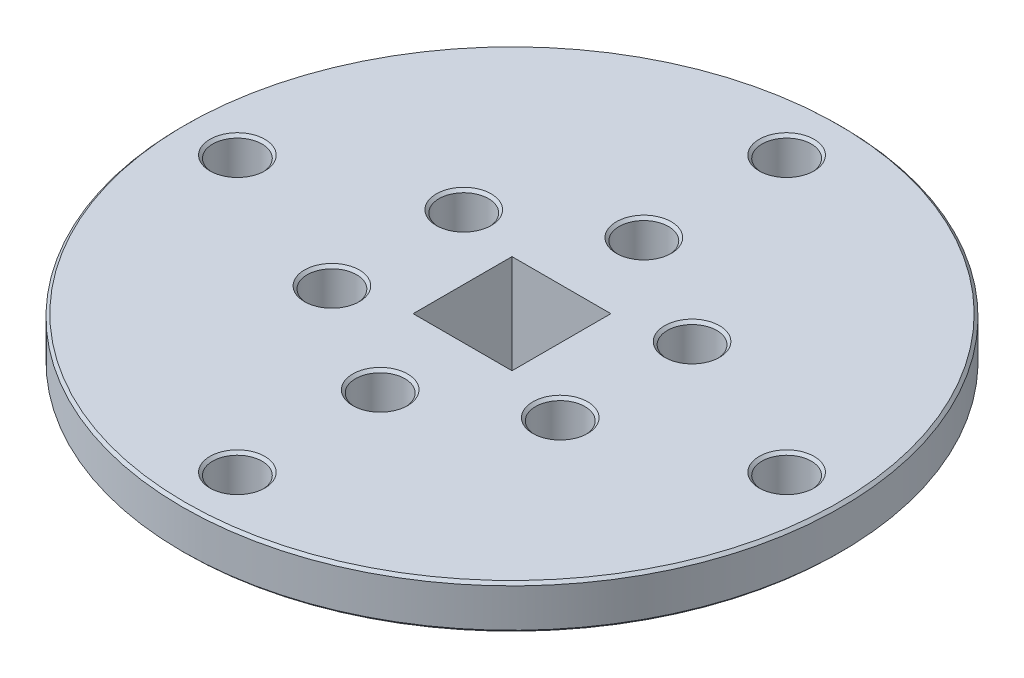
ISO-10303-21;
HEADER;
FILE_DESCRIPTION(('STEP AP214'),'2;1');
FILE_NAME('part.step','',(''),(''),'','','');
FILE_SCHEMA(('AUTOMOTIVE_DESIGN { 1 0 10303 214 1 1 1 1 }'));
ENDSEC;
DATA;
#1=APPLICATION_CONTEXT('core data for automotive mechanical design processes');
#2=APPLICATION_PROTOCOL_DEFINITION('international standard','automotive_design',2000,#1);
#3=PRODUCT_CONTEXT('',#1,'mechanical');
#4=PRODUCT('Part','Part','',(#3));
#5=PRODUCT_RELATED_PRODUCT_CATEGORY('part','',(#4));
#6=PRODUCT_DEFINITION_FORMATION('','',#4);
#7=PRODUCT_DEFINITION_CONTEXT('part definition',#1,'design');
#8=PRODUCT_DEFINITION('design','',#6,#7);
#9=PRODUCT_DEFINITION_SHAPE('','',#8);
#10=(LENGTH_UNIT() NAMED_UNIT(*) SI_UNIT(.MILLI.,.METRE.));
#11=(NAMED_UNIT(*) PLANE_ANGLE_UNIT() SI_UNIT($,.RADIAN.));
#12=(NAMED_UNIT(*) SI_UNIT($,.STERADIAN.) SOLID_ANGLE_UNIT());
#13=UNCERTAINTY_MEASURE_WITH_UNIT(LENGTH_MEASURE(1.E-05),#10,'distance_accuracy_value','');
#14=(GEOMETRIC_REPRESENTATION_CONTEXT(3) GLOBAL_UNCERTAINTY_ASSIGNED_CONTEXT((#13)) GLOBAL_UNIT_ASSIGNED_CONTEXT((#10,
#11,#12)) REPRESENTATION_CONTEXT('',''));
#15=CARTESIAN_POINT('',(0.,0.,0.));
#16=DIRECTION('',(0.,0.,1.));
#17=DIRECTION('',(1.,0.,0.));
#18=AXIS2_PLACEMENT_3D('',#15,#16,#17);
#19=CARTESIAN_POINT('',(0.,5.,0.));
#20=DIRECTION('',(0.,-1.,0.));
#21=DIRECTION('',(0.,0.,-1.));
#22=AXIS2_PLACEMENT_3D('',#19,#20,#21);
#23=CYLINDRICAL_SURFACE('',#22,20.5);
#24=CARTESIAN_POINT('',(0.,0.24999999999999,0.));
#25=DIRECTION('',(0.,1.,0.));
#26=DIRECTION('',(0.,0.,1.));
#27=AXIS2_PLACEMENT_3D('',#24,#25,#26);
#28=CIRCLE('',#27,20.5);
#29=CARTESIAN_POINT('',(0.,0.24999999999999,20.5));
#30=VERTEX_POINT('',#29);
#31=EDGE_CURVE('E11',#30,#30,#28,.T.);
#32=ORIENTED_EDGE('',*,*,#31,.T.);
#33=EDGE_LOOP('',(#32));
#34=FACE_BOUND('',#33,.T.);
#35=CARTESIAN_POINT('',(0.,5.,0.));
#36=DIRECTION('',(0.,1.,0.));
#37=DIRECTION('',(0.,0.,1.));
#38=AXIS2_PLACEMENT_3D('',#35,#36,#37);
#39=CIRCLE('',#38,20.5);
#40=CARTESIAN_POINT('',(0.,5.,20.5));
#41=VERTEX_POINT('',#40);
#42=EDGE_CURVE('E89',#41,#41,#39,.T.);
#43=ORIENTED_EDGE('',*,*,#42,.F.);
#44=EDGE_LOOP('',(#43));
#45=FACE_BOUND('',#44,.T.);
#46=ADVANCED_FACE('F41',(#34,#45),#23,.T.);
#47=CARTESIAN_POINT('',(0.,0.,0.));
#48=DIRECTION('',(0.,1.,0.));
#49=DIRECTION('',(0.,0.,1.));
#50=AXIS2_PLACEMENT_3D('',#47,#48,#49);
#51=PLANE('',#50);
#52=CARTESIAN_POINT('',(0.,0.,-12.));
#53=DIRECTION('',(0.,1.,0.));
#54=DIRECTION('',(0.,0.,1.));
#55=AXIS2_PLACEMENT_3D('',#52,#53,#54);
#56=CIRCLE('',#55,2.49999999999999);
#57=CARTESIAN_POINT('',(0.,0.,-9.50000000000001));
#58=VERTEX_POINT('',#57);
#59=EDGE_CURVE('E176',#58,#58,#56,.T.);
#60=ORIENTED_EDGE('',*,*,#59,.T.);
#61=EDGE_LOOP('',(#60));
#62=FACE_BOUND('',#61,.T.);
#63=CARTESIAN_POINT('',(10.3923048454133,0.,-5.99999999999998));
#64=DIRECTION('',(0.,1.,0.));
#65=DIRECTION('',(0.,0.,1.));
#66=AXIS2_PLACEMENT_3D('',#63,#64,#65);
#67=CIRCLE('',#66,2.49999999999999);
#68=CARTESIAN_POINT('',(10.3923048454133,0.,-3.49999999999999));
#69=VERTEX_POINT('',#68);
#70=EDGE_CURVE('E173',#69,#69,#67,.T.);
#71=ORIENTED_EDGE('',*,*,#70,.T.);
#72=EDGE_LOOP('',(#71));
#73=FACE_BOUND('',#72,.T.);
#74=CARTESIAN_POINT('',(10.3923048454132,0.,6.00000000000005));
#75=DIRECTION('',(0.,1.,0.));
#76=DIRECTION('',(0.,0.,1.));
#77=AXIS2_PLACEMENT_3D('',#74,#75,#76);
#78=CIRCLE('',#77,2.5);
#79=CARTESIAN_POINT('',(10.3923048454132,0.,8.50000000000005));
#80=VERTEX_POINT('',#79);
#81=EDGE_CURVE('E170',#80,#80,#78,.T.);
#82=ORIENTED_EDGE('',*,*,#81,.T.);
#83=EDGE_LOOP('',(#82));
#84=FACE_BOUND('',#83,.T.);
#85=CARTESIAN_POINT('',(0.,0.,12.));
#86=DIRECTION('',(0.,1.,0.));
#87=DIRECTION('',(0.,0.,1.));
#88=AXIS2_PLACEMENT_3D('',#85,#86,#87);
#89=CIRCLE('',#88,2.50000000000001);
#90=CARTESIAN_POINT('',(0.,0.,14.5));
#91=VERTEX_POINT('',#90);
#92=EDGE_CURVE('E167',#91,#91,#89,.T.);
#93=ORIENTED_EDGE('',*,*,#92,.T.);
#94=EDGE_LOOP('',(#93));
#95=FACE_BOUND('',#94,.T.);
#96=CARTESIAN_POINT('',(-10.3923048454133,0.,5.99999999999991));
#97=DIRECTION('',(0.,1.,0.));
#98=DIRECTION('',(0.,0.,1.));
#99=AXIS2_PLACEMENT_3D('',#96,#97,#98);
#100=CIRCLE('',#99,2.5);
#101=CARTESIAN_POINT('',(-10.3923048454133,0.,8.4999999999999));
#102=VERTEX_POINT('',#101);
#103=EDGE_CURVE('E164',#102,#102,#100,.T.);
#104=ORIENTED_EDGE('',*,*,#103,.T.);
#105=EDGE_LOOP('',(#104));
#106=FACE_BOUND('',#105,.T.);
#107=CARTESIAN_POINT('',(-10.3923048454132,0.,-6.00000000000012));
#108=DIRECTION('',(0.,1.,0.));
#109=DIRECTION('',(0.,0.,1.));
#110=AXIS2_PLACEMENT_3D('',#107,#108,#109);
#111=CIRCLE('',#110,2.50000000000001);
#112=CARTESIAN_POINT('',(-10.3923048454132,0.,-3.50000000000011));
#113=VERTEX_POINT('',#112);
#114=EDGE_CURVE('E161',#113,#113,#111,.T.);
#115=ORIENTED_EDGE('',*,*,#114,.T.);
#116=EDGE_LOOP('',(#115));
#117=FACE_BOUND('',#116,.T.);
#118=CARTESIAN_POINT('',(0.,0.,0.));
#119=DIRECTION('',(0.,1.,0.));
#120=DIRECTION('',(0.,0.,1.));
#121=AXIS2_PLACEMENT_3D('',#118,#119,#120);
#122=CIRCLE('',#121,20.25);
#123=CARTESIAN_POINT('',(0.,0.,20.25));
#124=VERTEX_POINT('',#123);
#125=EDGE_CURVE('E158',#124,#124,#122,.F.);
#126=ORIENTED_EDGE('',*,*,#125,.T.);
#127=EDGE_LOOP('',(#126));
#128=FACE_BOUND('',#127,.T.);
#129=DIRECTION('',(-1.,0.,0.));
#130=VECTOR('',#129,1.);
#131=CARTESIAN_POINT('',(-4.5,0.,4.5));
#132=LINE('',#131,#130);
#133=CARTESIAN_POINT('',(4.5,0.,4.5));
#134=VERTEX_POINT('',#133);
#135=CARTESIAN_POINT('',(-4.5,0.,4.5));
#136=VERTEX_POINT('',#135);
#137=EDGE_CURVE('E101',#134,#136,#132,.T.);
#138=ORIENTED_EDGE('',*,*,#137,.F.);
#139=DIRECTION('',(0.,0.,1.));
#140=VECTOR('',#139,1.);
#141=CARTESIAN_POINT('',(4.5,0.,-4.5));
#142=LINE('',#141,#140);
#143=CARTESIAN_POINT('',(4.5,0.,-4.5));
#144=VERTEX_POINT('',#143);
#145=EDGE_CURVE('E57',#144,#134,#142,.T.);
#146=ORIENTED_EDGE('',*,*,#145,.F.);
#147=DIRECTION('',(1.,0.,0.));
#148=VECTOR('',#147,1.);
#149=CARTESIAN_POINT('',(-4.5,0.,-4.5));
#150=LINE('',#149,#148);
#151=CARTESIAN_POINT('',(-4.5,0.,-4.5));
#152=VERTEX_POINT('',#151);
#153=EDGE_CURVE('E95',#152,#144,#150,.T.);
#154=ORIENTED_EDGE('',*,*,#153,.F.);
#155=DIRECTION('',(0.,0.,-1.));
#156=VECTOR('',#155,1.);
#157=CARTESIAN_POINT('',(-4.5,0.,-4.5));
#158=LINE('',#157,#156);
#159=EDGE_CURVE('E108',#136,#152,#158,.T.);
#160=ORIENTED_EDGE('',*,*,#159,.F.);
#161=EDGE_LOOP('',(#138,#146,#154,#160));
#162=FACE_BOUND('',#161,.T.);
#163=ADVANCED_FACE('F275',(#62,#73,#84,#95,#106,#117,#128,#162),#51,.F.);
#164=CARTESIAN_POINT('',(0.,9.,0.));
#165=DIRECTION('',(0.,-1.,0.));
#166=DIRECTION('',(0.,0.,-1.));
#167=AXIS2_PLACEMENT_3D('',#164,#165,#166);
#168=CYLINDRICAL_SURFACE('',#167,30.);
#169=CARTESIAN_POINT('',(0.,8.75,0.));
#170=DIRECTION('',(0.,1.,0.));
#171=DIRECTION('',(0.,0.,1.));
#172=AXIS2_PLACEMENT_3D('',#169,#170,#171);
#173=CIRCLE('',#172,30.);
#174=CARTESIAN_POINT('',(0.,8.75,30.));
#175=VERTEX_POINT('',#174);
#176=EDGE_CURVE('E50',#175,#175,#173,.F.);
#177=ORIENTED_EDGE('',*,*,#176,.T.);
#178=EDGE_LOOP('',(#177));
#179=FACE_BOUND('',#178,.T.);
#180=CARTESIAN_POINT('',(0.,5.25,0.));
#181=DIRECTION('',(0.,1.,0.));
#182=DIRECTION('',(0.,0.,1.));
#183=AXIS2_PLACEMENT_3D('',#180,#181,#182);
#184=CIRCLE('',#183,30.);
#185=CARTESIAN_POINT('',(0.,5.25,30.));
#186=VERTEX_POINT('',#185);
#187=EDGE_CURVE('E248',#186,#186,#184,.T.);
#188=ORIENTED_EDGE('',*,*,#187,.T.);
#189=EDGE_LOOP('',(#188));
#190=FACE_BOUND('',#189,.T.);
#191=ADVANCED_FACE('F253',(#179,#190),#168,.T.);
#192=CARTESIAN_POINT('',(0.,9.,0.));
#193=DIRECTION('',(0.,1.,0.));
#194=DIRECTION('',(0.,0.,1.));
#195=AXIS2_PLACEMENT_3D('',#192,#193,#194);
#196=PLANE('',#195);
#197=CARTESIAN_POINT('',(0.,9.,-12.));
#198=DIRECTION('',(0.,1.,0.));
#199=DIRECTION('',(0.,0.,1.));
#200=AXIS2_PLACEMENT_3D('',#197,#198,#199);
#201=CIRCLE('',#200,2.50000000000001);
#202=CARTESIAN_POINT('',(0.,9.,-9.49999999999999));
#203=VERTEX_POINT('',#202);
#204=EDGE_CURVE('E155',#203,#203,#201,.F.);
#205=ORIENTED_EDGE('',*,*,#204,.T.);
#206=EDGE_LOOP('',(#205));
#207=FACE_BOUND('',#206,.T.);
#208=CARTESIAN_POINT('',(10.3923048454133,9.,-5.99999999999998));
#209=DIRECTION('',(0.,1.,0.));
#210=DIRECTION('',(0.,0.,1.));
#211=AXIS2_PLACEMENT_3D('',#208,#209,#210);
#212=CIRCLE('',#211,2.50000000000001);
#213=CARTESIAN_POINT('',(10.3923048454133,9.,-3.49999999999997));
#214=VERTEX_POINT('',#213);
#215=EDGE_CURVE('E152',#214,#214,#212,.F.);
#216=ORIENTED_EDGE('',*,*,#215,.T.);
#217=EDGE_LOOP('',(#216));
#218=FACE_BOUND('',#217,.T.);
#219=CARTESIAN_POINT('',(10.3923048454132,9.,6.00000000000005));
#220=DIRECTION('',(0.,1.,0.));
#221=DIRECTION('',(0.,0.,1.));
#222=AXIS2_PLACEMENT_3D('',#219,#220,#221);
#223=CIRCLE('',#222,2.50000000000001);
#224=CARTESIAN_POINT('',(10.3923048454132,9.,8.50000000000006));
#225=VERTEX_POINT('',#224);
#226=EDGE_CURVE('E149',#225,#225,#223,.F.);
#227=ORIENTED_EDGE('',*,*,#226,.T.);
#228=EDGE_LOOP('',(#227));
#229=FACE_BOUND('',#228,.T.);
#230=CARTESIAN_POINT('',(0.,9.,12.));
#231=DIRECTION('',(0.,1.,0.));
#232=DIRECTION('',(0.,0.,1.));
#233=AXIS2_PLACEMENT_3D('',#230,#231,#232);
#234=CIRCLE('',#233,2.50000000000001);
#235=CARTESIAN_POINT('',(0.,9.,14.5));
#236=VERTEX_POINT('',#235);
#237=EDGE_CURVE('E146',#236,#236,#234,.F.);
#238=ORIENTED_EDGE('',*,*,#237,.T.);
#239=EDGE_LOOP('',(#238));
#240=FACE_BOUND('',#239,.T.);
#241=CARTESIAN_POINT('',(-10.3923048454133,9.,5.99999999999991));
#242=DIRECTION('',(0.,1.,0.));
#243=DIRECTION('',(0.,0.,1.));
#244=AXIS2_PLACEMENT_3D('',#241,#242,#243);
#245=CIRCLE('',#244,2.50000000000001);
#246=CARTESIAN_POINT('',(-10.3923048454133,9.,8.49999999999991));
#247=VERTEX_POINT('',#246);
#248=EDGE_CURVE('E143',#247,#247,#245,.F.);
#249=ORIENTED_EDGE('',*,*,#248,.T.);
#250=EDGE_LOOP('',(#249));
#251=FACE_BOUND('',#250,.T.);
#252=CARTESIAN_POINT('',(-10.3923048454132,9.,-6.00000000000012));
#253=DIRECTION('',(0.,1.,0.));
#254=DIRECTION('',(0.,0.,1.));
#255=AXIS2_PLACEMENT_3D('',#252,#253,#254);
#256=CIRCLE('',#255,2.50000000000001);
#257=CARTESIAN_POINT('',(-10.3923048454132,9.,-3.50000000000011));
#258=VERTEX_POINT('',#257);
#259=EDGE_CURVE('E140',#258,#258,#256,.F.);
#260=ORIENTED_EDGE('',*,*,#259,.T.);
#261=EDGE_LOOP('',(#260));
#262=FACE_BOUND('',#261,.T.);
#263=CARTESIAN_POINT('',(0.,9.,-25.));
#264=DIRECTION('',(0.,1.,0.));
#265=DIRECTION('',(0.,0.,1.));
#266=AXIS2_PLACEMENT_3D('',#263,#264,#265);
#267=CIRCLE('',#266,2.5);
#268=CARTESIAN_POINT('',(0.,9.,-22.5));
#269=VERTEX_POINT('',#268);
#270=EDGE_CURVE('E137',#269,#269,#267,.F.);
#271=ORIENTED_EDGE('',*,*,#270,.T.);
#272=EDGE_LOOP('',(#271));
#273=FACE_BOUND('',#272,.T.);
#274=CARTESIAN_POINT('',(25.,9.,0.));
#275=DIRECTION('',(0.,1.,0.));
#276=DIRECTION('',(0.,0.,1.));
#277=AXIS2_PLACEMENT_3D('',#274,#275,#276);
#278=CIRCLE('',#277,2.49999999999999);
#279=CARTESIAN_POINT('',(25.,9.,2.49999999999999));
#280=VERTEX_POINT('',#279);
#281=EDGE_CURVE('E134',#280,#280,#278,.F.);
#282=ORIENTED_EDGE('',*,*,#281,.T.);
#283=EDGE_LOOP('',(#282));
#284=FACE_BOUND('',#283,.T.);
#285=CARTESIAN_POINT('',(0.,9.,25.));
#286=DIRECTION('',(0.,1.,0.));
#287=DIRECTION('',(0.,0.,1.));
#288=AXIS2_PLACEMENT_3D('',#285,#286,#287);
#289=CIRCLE('',#288,2.5);
#290=CARTESIAN_POINT('',(0.,9.,27.5));
#291=VERTEX_POINT('',#290);
#292=EDGE_CURVE('E131',#291,#291,#289,.F.);
#293=ORIENTED_EDGE('',*,*,#292,.T.);
#294=EDGE_LOOP('',(#293));
#295=FACE_BOUND('',#294,.T.);
#296=CARTESIAN_POINT('',(-25.,9.,0.));
#297=DIRECTION('',(0.,1.,0.));
#298=DIRECTION('',(0.,0.,1.));
#299=AXIS2_PLACEMENT_3D('',#296,#297,#298);
#300=CIRCLE('',#299,2.49999999999999);
#301=CARTESIAN_POINT('',(-25.,9.,2.49999999999999));
#302=VERTEX_POINT('',#301);
#303=EDGE_CURVE('E128',#302,#302,#300,.F.);
#304=ORIENTED_EDGE('',*,*,#303,.T.);
#305=EDGE_LOOP('',(#304));
#306=FACE_BOUND('',#305,.T.);
#307=CARTESIAN_POINT('',(0.,9.,0.));
#308=DIRECTION('',(0.,1.,0.));
#309=DIRECTION('',(0.,0.,1.));
#310=AXIS2_PLACEMENT_3D('',#307,#308,#309);
#311=CIRCLE('',#310,29.75);
#312=CARTESIAN_POINT('',(0.,9.,29.75));
#313=VERTEX_POINT('',#312);
#314=EDGE_CURVE('E125',#313,#313,#311,.T.);
#315=ORIENTED_EDGE('',*,*,#314,.T.);
#316=EDGE_LOOP('',(#315));
#317=FACE_BOUND('',#316,.T.);
#318=DIRECTION('',(0.,0.,1.));
#319=VECTOR('',#318,1.);
#320=CARTESIAN_POINT('',(4.5,9.,-4.5));
#321=LINE('',#320,#319);
#322=CARTESIAN_POINT('',(4.5,9.,-4.5));
#323=VERTEX_POINT('',#322);
#324=CARTESIAN_POINT('',(4.5,9.,4.5));
#325=VERTEX_POINT('',#324);
#326=EDGE_CURVE('E93',#323,#325,#321,.T.);
#327=ORIENTED_EDGE('',*,*,#326,.T.);
#328=DIRECTION('',(-1.,0.,0.));
#329=VECTOR('',#328,1.);
#330=CARTESIAN_POINT('',(-4.5,9.,4.5));
#331=LINE('',#330,#329);
#332=CARTESIAN_POINT('',(-4.5,9.,4.5));
#333=VERTEX_POINT('',#332);
#334=EDGE_CURVE('E82',#325,#333,#331,.T.);
#335=ORIENTED_EDGE('',*,*,#334,.T.);
#336=DIRECTION('',(0.,0.,-1.));
#337=VECTOR('',#336,1.);
#338=CARTESIAN_POINT('',(-4.5,9.,-4.5));
#339=LINE('',#338,#337);
#340=CARTESIAN_POINT('',(-4.5,9.,-4.5));
#341=VERTEX_POINT('',#340);
#342=EDGE_CURVE('E103',#333,#341,#339,.T.);
#343=ORIENTED_EDGE('',*,*,#342,.T.);
#344=DIRECTION('',(1.,0.,0.));
#345=VECTOR('',#344,1.);
#346=CARTESIAN_POINT('',(-4.5,9.,-4.5));
#347=LINE('',#346,#345);
#348=EDGE_CURVE('E99',#341,#323,#347,.T.);
#349=ORIENTED_EDGE('',*,*,#348,.T.);
#350=EDGE_LOOP('',(#327,#335,#343,#349));
#351=FACE_BOUND('',#350,.T.);
#352=ADVANCED_FACE('F98',(#207,#218,#229,#240,#251,#262,#273,#284,#295,#306,#317,#351),#196,.T.);
#353=CARTESIAN_POINT('',(0.,5.,0.));
#354=DIRECTION('',(0.,1.,0.));
#355=DIRECTION('',(0.,0.,1.));
#356=AXIS2_PLACEMENT_3D('',#353,#354,#355);
#357=PLANE('',#356);
#358=CARTESIAN_POINT('',(0.,5.,-25.));
#359=DIRECTION('',(0.,1.,0.));
#360=DIRECTION('',(0.,0.,1.));
#361=AXIS2_PLACEMENT_3D('',#358,#359,#360);
#362=CIRCLE('',#361,2.50000000000001);
#363=CARTESIAN_POINT('',(0.,5.,-22.5));
#364=VERTEX_POINT('',#363);
#365=EDGE_CURVE('E227',#364,#364,#362,.T.);
#366=ORIENTED_EDGE('',*,*,#365,.T.);
#367=EDGE_LOOP('',(#366));
#368=FACE_BOUND('',#367,.T.);
#369=CARTESIAN_POINT('',(25.,5.,0.));
#370=DIRECTION('',(0.,1.,0.));
#371=DIRECTION('',(0.,0.,1.));
#372=AXIS2_PLACEMENT_3D('',#369,#370,#371);
#373=CIRCLE('',#372,2.50000000000001);
#374=CARTESIAN_POINT('',(25.,5.,2.50000000000001));
#375=VERTEX_POINT('',#374);
#376=EDGE_CURVE('E224',#375,#375,#373,.T.);
#377=ORIENTED_EDGE('',*,*,#376,.T.);
#378=EDGE_LOOP('',(#377));
#379=FACE_BOUND('',#378,.T.);
#380=CARTESIAN_POINT('',(0.,5.,25.));
#381=DIRECTION('',(0.,1.,0.));
#382=DIRECTION('',(0.,0.,1.));
#383=AXIS2_PLACEMENT_3D('',#380,#381,#382);
#384=CIRCLE('',#383,2.50000000000001);
#385=CARTESIAN_POINT('',(0.,5.,27.5));
#386=VERTEX_POINT('',#385);
#387=EDGE_CURVE('E221',#386,#386,#384,.T.);
#388=ORIENTED_EDGE('',*,*,#387,.T.);
#389=EDGE_LOOP('',(#388));
#390=FACE_BOUND('',#389,.T.);
#391=CARTESIAN_POINT('',(-25.,5.,0.));
#392=DIRECTION('',(0.,1.,0.));
#393=DIRECTION('',(0.,0.,1.));
#394=AXIS2_PLACEMENT_3D('',#391,#392,#393);
#395=CIRCLE('',#394,2.50000000000001);
#396=CARTESIAN_POINT('',(-25.,5.,2.50000000000001));
#397=VERTEX_POINT('',#396);
#398=EDGE_CURVE('E218',#397,#397,#395,.T.);
#399=ORIENTED_EDGE('',*,*,#398,.T.);
#400=EDGE_LOOP('',(#399));
#401=FACE_BOUND('',#400,.T.);
#402=CARTESIAN_POINT('',(0.,5.,0.));
#403=DIRECTION('',(0.,1.,0.));
#404=DIRECTION('',(0.,0.,1.));
#405=AXIS2_PLACEMENT_3D('',#402,#403,#404);
#406=CIRCLE('',#405,29.75);
#407=CARTESIAN_POINT('',(0.,5.,29.75));
#408=VERTEX_POINT('',#407);
#409=EDGE_CURVE('E215',#408,#408,#406,.F.);
#410=ORIENTED_EDGE('',*,*,#409,.T.);
#411=EDGE_LOOP('',(#410));
#412=FACE_BOUND('',#411,.T.);
#413=ORIENTED_EDGE('',*,*,#42,.T.);
#414=EDGE_LOOP('',(#413));
#415=FACE_BOUND('',#414,.T.);
#416=ADVANCED_FACE('F265',(#368,#379,#390,#401,#412,#415),#357,.F.);
#417=CARTESIAN_POINT('',(-25.,5.,0.));
#418=DIRECTION('',(0.,-1.,0.));
#419=DIRECTION('',(0.,0.,-1.));
#420=AXIS2_PLACEMENT_3D('',#417,#418,#419);
#421=CYLINDRICAL_SURFACE('',#420,2.25);
#422=CARTESIAN_POINT('',(-25.,5.25,0.));
#423=DIRECTION('',(0.,1.,0.));
#424=DIRECTION('',(0.,0.,1.));
#425=AXIS2_PLACEMENT_3D('',#422,#423,#424);
#426=CIRCLE('',#425,2.25);
#427=CARTESIAN_POINT('',(-25.,5.25,2.25));
#428=VERTEX_POINT('',#427);
#429=EDGE_CURVE('E245',#428,#428,#426,.F.);
#430=ORIENTED_EDGE('',*,*,#429,.T.);
#431=EDGE_LOOP('',(#430));
#432=FACE_BOUND('',#431,.T.);
#433=CARTESIAN_POINT('',(-25.,8.75000000000001,0.));
#434=DIRECTION('',(0.,1.,0.));
#435=DIRECTION('',(0.,0.,1.));
#436=AXIS2_PLACEMENT_3D('',#433,#434,#435);
#437=CIRCLE('',#436,2.25);
#438=CARTESIAN_POINT('',(-25.,8.75000000000001,2.25));
#439=VERTEX_POINT('',#438);
#440=EDGE_CURVE('E242',#439,#439,#437,.T.);
#441=ORIENTED_EDGE('',*,*,#440,.T.);
#442=EDGE_LOOP('',(#441));
#443=FACE_BOUND('',#442,.T.);
#444=ADVANCED_FACE('F272',(#432,#443),#421,.F.);
#445=CARTESIAN_POINT('',(0.,5.,25.));
#446=DIRECTION('',(0.,-1.,0.));
#447=DIRECTION('',(0.,0.,-1.));
#448=AXIS2_PLACEMENT_3D('',#445,#446,#447);
#449=CYLINDRICAL_SURFACE('',#448,2.25);
#450=CARTESIAN_POINT('',(0.,5.25,25.));
#451=DIRECTION('',(0.,1.,0.));
#452=DIRECTION('',(0.,0.,1.));
#453=AXIS2_PLACEMENT_3D('',#450,#451,#452);
#454=CIRCLE('',#453,2.25);
#455=CARTESIAN_POINT('',(0.,5.25,27.25));
#456=VERTEX_POINT('',#455);
#457=EDGE_CURVE('E239',#456,#456,#454,.F.);
#458=ORIENTED_EDGE('',*,*,#457,.T.);
#459=EDGE_LOOP('',(#458));
#460=FACE_BOUND('',#459,.T.);
#461=CARTESIAN_POINT('',(0.,8.75,25.));
#462=DIRECTION('',(0.,1.,0.));
#463=DIRECTION('',(0.,0.,1.));
#464=AXIS2_PLACEMENT_3D('',#461,#462,#463);
#465=CIRCLE('',#464,2.25);
#466=CARTESIAN_POINT('',(0.,8.75,27.25));
#467=VERTEX_POINT('',#466);
#468=EDGE_CURVE('E236',#467,#467,#465,.T.);
#469=ORIENTED_EDGE('',*,*,#468,.T.);
#470=EDGE_LOOP('',(#469));
#471=FACE_BOUND('',#470,.T.);
#472=ADVANCED_FACE('F493',(#460,#471),#449,.F.);
#473=CARTESIAN_POINT('',(25.,5.,0.));
#474=DIRECTION('',(0.,-1.,0.));
#475=DIRECTION('',(0.,0.,-1.));
#476=AXIS2_PLACEMENT_3D('',#473,#474,#475);
#477=CYLINDRICAL_SURFACE('',#476,2.25);
#478=CARTESIAN_POINT('',(25.,5.25,0.));
#479=DIRECTION('',(0.,1.,0.));
#480=DIRECTION('',(0.,0.,1.));
#481=AXIS2_PLACEMENT_3D('',#478,#479,#480);
#482=CIRCLE('',#481,2.25);
#483=CARTESIAN_POINT('',(25.,5.25,2.25));
#484=VERTEX_POINT('',#483);
#485=EDGE_CURVE('E233',#484,#484,#482,.F.);
#486=ORIENTED_EDGE('',*,*,#485,.T.);
#487=EDGE_LOOP('',(#486));
#488=FACE_BOUND('',#487,.T.);
#489=CARTESIAN_POINT('',(25.,8.75000000000001,0.));
#490=DIRECTION('',(0.,1.,0.));
#491=DIRECTION('',(0.,0.,1.));
#492=AXIS2_PLACEMENT_3D('',#489,#490,#491);
#493=CIRCLE('',#492,2.25);
#494=CARTESIAN_POINT('',(25.,8.75000000000001,2.25));
#495=VERTEX_POINT('',#494);
#496=EDGE_CURVE('E230',#495,#495,#493,.T.);
#497=ORIENTED_EDGE('',*,*,#496,.T.);
#498=EDGE_LOOP('',(#497));
#499=FACE_BOUND('',#498,.T.);
#500=ADVANCED_FACE('F489',(#488,#499),#477,.F.);
#501=CARTESIAN_POINT('',(0.,5.,-25.));
#502=DIRECTION('',(0.,-1.,0.));
#503=DIRECTION('',(0.,0.,-1.));
#504=AXIS2_PLACEMENT_3D('',#501,#502,#503);
#505=CYLINDRICAL_SURFACE('',#504,2.25);
#506=CARTESIAN_POINT('',(0.,5.25,-25.));
#507=DIRECTION('',(0.,1.,0.));
#508=DIRECTION('',(0.,0.,1.));
#509=AXIS2_PLACEMENT_3D('',#506,#507,#508);
#510=CIRCLE('',#509,2.25);
#511=CARTESIAN_POINT('',(0.,5.25,-22.75));
#512=VERTEX_POINT('',#511);
#513=EDGE_CURVE('E212',#512,#512,#510,.F.);
#514=ORIENTED_EDGE('',*,*,#513,.T.);
#515=EDGE_LOOP('',(#514));
#516=FACE_BOUND('',#515,.T.);
#517=CARTESIAN_POINT('',(0.,8.75,-25.));
#518=DIRECTION('',(0.,1.,0.));
#519=DIRECTION('',(0.,0.,1.));
#520=AXIS2_PLACEMENT_3D('',#517,#518,#519);
#521=CIRCLE('',#520,2.25);
#522=CARTESIAN_POINT('',(0.,8.75,-22.75));
#523=VERTEX_POINT('',#522);
#524=EDGE_CURVE('E209',#523,#523,#521,.T.);
#525=ORIENTED_EDGE('',*,*,#524,.T.);
#526=EDGE_LOOP('',(#525));
#527=FACE_BOUND('',#526,.T.);
#528=ADVANCED_FACE('F485',(#516,#527),#505,.F.);
#529=CARTESIAN_POINT('',(-10.3923048454132,9.,-6.00000000000012));
#530=DIRECTION('',(0.,1.,0.));
#531=DIRECTION('',(0.,0.,1.));
#532=AXIS2_PLACEMENT_3D('',#529,#530,#531);
#533=CYLINDRICAL_SURFACE('',#532,2.25);
#534=CARTESIAN_POINT('',(-10.3923048454132,8.74999999999999,-6.00000000000012));
#535=DIRECTION('',(0.,1.,0.));
#536=DIRECTION('',(0.,0.,1.));
#537=AXIS2_PLACEMENT_3D('',#534,#535,#536);
#538=CIRCLE('',#537,2.25);
#539=CARTESIAN_POINT('',(-10.3923048454132,8.74999999999999,-3.75000000000012));
#540=VERTEX_POINT('',#539);
#541=EDGE_CURVE('E206',#540,#540,#538,.T.);
#542=ORIENTED_EDGE('',*,*,#541,.T.);
#543=EDGE_LOOP('',(#542));
#544=FACE_BOUND('',#543,.T.);
#545=CARTESIAN_POINT('',(-10.3923048454132,0.250000000000007,-6.00000000000012));
#546=DIRECTION('',(0.,1.,0.));
#547=DIRECTION('',(0.,0.,1.));
#548=AXIS2_PLACEMENT_3D('',#545,#546,#547);
#549=CIRCLE('',#548,2.25);
#550=CARTESIAN_POINT('',(-10.3923048454132,0.250000000000007,-3.75000000000012));
#551=VERTEX_POINT('',#550);
#552=EDGE_CURVE('E203',#551,#551,#549,.F.);
#553=ORIENTED_EDGE('',*,*,#552,.T.);
#554=EDGE_LOOP('',(#553));
#555=FACE_BOUND('',#554,.T.);
#556=ADVANCED_FACE('F481',(#544,#555),#533,.F.);
#557=CARTESIAN_POINT('',(-10.3923048454133,9.,5.99999999999991));
#558=DIRECTION('',(0.,1.,0.));
#559=DIRECTION('',(0.,0.,1.));
#560=AXIS2_PLACEMENT_3D('',#557,#558,#559);
#561=CYLINDRICAL_SURFACE('',#560,2.25);
#562=CARTESIAN_POINT('',(-10.3923048454133,8.74999999999999,5.99999999999991));
#563=DIRECTION('',(0.,1.,0.));
#564=DIRECTION('',(0.,0.,1.));
#565=AXIS2_PLACEMENT_3D('',#562,#563,#564);
#566=CIRCLE('',#565,2.25);
#567=CARTESIAN_POINT('',(-10.3923048454133,8.74999999999999,8.24999999999991));
#568=VERTEX_POINT('',#567);
#569=EDGE_CURVE('E200',#568,#568,#566,.T.);
#570=ORIENTED_EDGE('',*,*,#569,.T.);
#571=EDGE_LOOP('',(#570));
#572=FACE_BOUND('',#571,.T.);
#573=CARTESIAN_POINT('',(-10.3923048454133,0.249999999999997,5.99999999999991));
#574=DIRECTION('',(0.,1.,0.));
#575=DIRECTION('',(0.,0.,1.));
#576=AXIS2_PLACEMENT_3D('',#573,#574,#575);
#577=CIRCLE('',#576,2.25);
#578=CARTESIAN_POINT('',(-10.3923048454133,0.249999999999997,8.24999999999991));
#579=VERTEX_POINT('',#578);
#580=EDGE_CURVE('E197',#579,#579,#577,.F.);
#581=ORIENTED_EDGE('',*,*,#580,.T.);
#582=EDGE_LOOP('',(#581));
#583=FACE_BOUND('',#582,.T.);
#584=ADVANCED_FACE('F477',(#572,#583),#561,.F.);
#585=CARTESIAN_POINT('',(0.,9.,12.));
#586=DIRECTION('',(0.,1.,0.));
#587=DIRECTION('',(0.,0.,1.));
#588=AXIS2_PLACEMENT_3D('',#585,#586,#587);
#589=CYLINDRICAL_SURFACE('',#588,2.25);
#590=CARTESIAN_POINT('',(0.,8.74999999999999,12.));
#591=DIRECTION('',(0.,1.,0.));
#592=DIRECTION('',(0.,0.,1.));
#593=AXIS2_PLACEMENT_3D('',#590,#591,#592);
#594=CIRCLE('',#593,2.25);
#595=CARTESIAN_POINT('',(0.,8.74999999999999,14.25));
#596=VERTEX_POINT('',#595);
#597=EDGE_CURVE('E194',#596,#596,#594,.T.);
#598=ORIENTED_EDGE('',*,*,#597,.T.);
#599=EDGE_LOOP('',(#598));
#600=FACE_BOUND('',#599,.T.);
#601=CARTESIAN_POINT('',(0.,0.250000000000007,12.));
#602=DIRECTION('',(0.,1.,0.));
#603=DIRECTION('',(0.,0.,1.));
#604=AXIS2_PLACEMENT_3D('',#601,#602,#603);
#605=CIRCLE('',#604,2.25);
#606=CARTESIAN_POINT('',(0.,0.250000000000007,14.25));
#607=VERTEX_POINT('',#606);
#608=EDGE_CURVE('E191',#607,#607,#605,.F.);
#609=ORIENTED_EDGE('',*,*,#608,.T.);
#610=EDGE_LOOP('',(#609));
#611=FACE_BOUND('',#610,.T.);
#612=ADVANCED_FACE('F473',(#600,#611),#589,.F.);
#613=CARTESIAN_POINT('',(10.3923048454132,9.,6.00000000000005));
#614=DIRECTION('',(0.,1.,0.));
#615=DIRECTION('',(0.,0.,1.));
#616=AXIS2_PLACEMENT_3D('',#613,#614,#615);
#617=CYLINDRICAL_SURFACE('',#616,2.25);
#618=CARTESIAN_POINT('',(10.3923048454132,8.75,6.00000000000005));
#619=DIRECTION('',(0.,1.,0.));
#620=DIRECTION('',(0.,0.,1.));
#621=AXIS2_PLACEMENT_3D('',#618,#619,#620);
#622=CIRCLE('',#621,2.25);
#623=CARTESIAN_POINT('',(10.3923048454132,8.75,8.25000000000005));
#624=VERTEX_POINT('',#623);
#625=EDGE_CURVE('E188',#624,#624,#622,.T.);
#626=ORIENTED_EDGE('',*,*,#625,.T.);
#627=EDGE_LOOP('',(#626));
#628=FACE_BOUND('',#627,.T.);
#629=CARTESIAN_POINT('',(10.3923048454132,0.249999999999995,6.00000000000005));
#630=DIRECTION('',(0.,1.,0.));
#631=DIRECTION('',(0.,0.,1.));
#632=AXIS2_PLACEMENT_3D('',#629,#630,#631);
#633=CIRCLE('',#632,2.25);
#634=CARTESIAN_POINT('',(10.3923048454132,0.249999999999995,8.25000000000005));
#635=VERTEX_POINT('',#634);
#636=EDGE_CURVE('E185',#635,#635,#633,.F.);
#637=ORIENTED_EDGE('',*,*,#636,.T.);
#638=EDGE_LOOP('',(#637));
#639=FACE_BOUND('',#638,.T.);
#640=ADVANCED_FACE('F469',(#628,#639),#617,.F.);
#641=CARTESIAN_POINT('',(10.3923048454133,9.,-5.99999999999998));
#642=DIRECTION('',(0.,1.,0.));
#643=DIRECTION('',(0.,0.,1.));
#644=AXIS2_PLACEMENT_3D('',#641,#642,#643);
#645=CYLINDRICAL_SURFACE('',#644,2.25);
#646=CARTESIAN_POINT('',(10.3923048454133,8.74999999999999,-5.99999999999998));
#647=DIRECTION('',(0.,1.,0.));
#648=DIRECTION('',(0.,0.,1.));
#649=AXIS2_PLACEMENT_3D('',#646,#647,#648);
#650=CIRCLE('',#649,2.25);
#651=CARTESIAN_POINT('',(10.3923048454133,8.74999999999999,-3.74999999999998));
#652=VERTEX_POINT('',#651);
#653=EDGE_CURVE('E182',#652,#652,#650,.T.);
#654=ORIENTED_EDGE('',*,*,#653,.T.);
#655=EDGE_LOOP('',(#654));
#656=FACE_BOUND('',#655,.T.);
#657=CARTESIAN_POINT('',(10.3923048454133,0.249999999999993,-5.99999999999998));
#658=DIRECTION('',(0.,1.,0.));
#659=DIRECTION('',(0.,0.,1.));
#660=AXIS2_PLACEMENT_3D('',#657,#658,#659);
#661=CIRCLE('',#660,2.25);
#662=CARTESIAN_POINT('',(10.3923048454133,0.249999999999993,-3.74999999999998));
#663=VERTEX_POINT('',#662);
#664=EDGE_CURVE('E179',#663,#663,#661,.F.);
#665=ORIENTED_EDGE('',*,*,#664,.T.);
#666=EDGE_LOOP('',(#665));
#667=FACE_BOUND('',#666,.T.);
#668=ADVANCED_FACE('F465',(#656,#667),#645,.F.);
#669=CARTESIAN_POINT('',(0.,9.,-12.));
#670=DIRECTION('',(0.,1.,0.));
#671=DIRECTION('',(0.,0.,1.));
#672=AXIS2_PLACEMENT_3D('',#669,#670,#671);
#673=CYLINDRICAL_SURFACE('',#672,2.25);
#674=CARTESIAN_POINT('',(0.,8.74999999999999,-12.));
#675=DIRECTION('',(0.,1.,0.));
#676=DIRECTION('',(0.,0.,1.));
#677=AXIS2_PLACEMENT_3D('',#674,#675,#676);
#678=CIRCLE('',#677,2.25);
#679=CARTESIAN_POINT('',(0.,8.74999999999999,-9.75));
#680=VERTEX_POINT('',#679);
#681=EDGE_CURVE('E122',#680,#680,#678,.T.);
#682=ORIENTED_EDGE('',*,*,#681,.T.);
#683=EDGE_LOOP('',(#682));
#684=FACE_BOUND('',#683,.T.);
#685=CARTESIAN_POINT('',(0.,0.249999999999993,-12.));
#686=DIRECTION('',(0.,1.,0.));
#687=DIRECTION('',(0.,0.,1.));
#688=AXIS2_PLACEMENT_3D('',#685,#686,#687);
#689=CIRCLE('',#688,2.25);
#690=CARTESIAN_POINT('',(0.,0.249999999999993,-9.75));
#691=VERTEX_POINT('',#690);
#692=EDGE_CURVE('E119',#691,#691,#689,.F.);
#693=ORIENTED_EDGE('',*,*,#692,.T.);
#694=EDGE_LOOP('',(#693));
#695=FACE_BOUND('',#694,.T.);
#696=ADVANCED_FACE('F459',(#684,#695),#673,.F.);
#697=CARTESIAN_POINT('',(4.5,9.001,-4.5));
#698=DIRECTION('',(1.,0.,0.));
#699=DIRECTION('',(0.,0.,-1.));
#700=AXIS2_PLACEMENT_3D('',#697,#698,#699);
#701=PLANE('',#700);
#702=DIRECTION('',(0.,-1.,0.));
#703=VECTOR('',#702,1.);
#704=CARTESIAN_POINT('',(4.5,9.001,-4.5));
#705=LINE('',#704,#703);
#706=EDGE_CURVE('E90',#323,#144,#705,.T.);
#707=ORIENTED_EDGE('',*,*,#706,.T.);
#708=ORIENTED_EDGE('',*,*,#145,.T.);
#709=DIRECTION('',(0.,-1.,0.));
#710=VECTOR('',#709,1.);
#711=CARTESIAN_POINT('',(4.5,9.001,4.5));
#712=LINE('',#711,#710);
#713=EDGE_CURVE('E84',#325,#134,#712,.T.);
#714=ORIENTED_EDGE('',*,*,#713,.F.);
#715=ORIENTED_EDGE('',*,*,#326,.F.);
#716=EDGE_LOOP('',(#707,#708,#714,#715));
#717=FACE_BOUND('',#716,.T.);
#718=ADVANCED_FACE('F92',(#717),#701,.F.);
#719=CARTESIAN_POINT('',(-4.5,9.001,-4.5));
#720=DIRECTION('',(0.,0.,-1.));
#721=DIRECTION('',(-1.,0.,0.));
#722=AXIS2_PLACEMENT_3D('',#719,#720,#721);
#723=PLANE('',#722);
#724=DIRECTION('',(0.,-1.,0.));
#725=VECTOR('',#724,1.);
#726=CARTESIAN_POINT('',(-4.5,9.001,-4.5));
#727=LINE('',#726,#725);
#728=EDGE_CURVE('E114',#341,#152,#727,.T.);
#729=ORIENTED_EDGE('',*,*,#728,.T.);
#730=ORIENTED_EDGE('',*,*,#153,.T.);
#731=ORIENTED_EDGE('',*,*,#706,.F.);
#732=ORIENTED_EDGE('',*,*,#348,.F.);
#733=EDGE_LOOP('',(#729,#730,#731,#732));
#734=FACE_BOUND('',#733,.T.);
#735=ADVANCED_FACE('F451',(#734),#723,.F.);
#736=CARTESIAN_POINT('',(-4.5,9.001,-4.5));
#737=DIRECTION('',(-1.,0.,0.));
#738=DIRECTION('',(0.,0.,1.));
#739=AXIS2_PLACEMENT_3D('',#736,#737,#738);
#740=PLANE('',#739);
#741=DIRECTION('',(0.,-1.,0.));
#742=VECTOR('',#741,1.);
#743=CARTESIAN_POINT('',(-4.5,9.001,4.5));
#744=LINE('',#743,#742);
#745=EDGE_CURVE('E65',#333,#136,#744,.T.);
#746=ORIENTED_EDGE('',*,*,#745,.T.);
#747=ORIENTED_EDGE('',*,*,#159,.T.);
#748=ORIENTED_EDGE('',*,*,#728,.F.);
#749=ORIENTED_EDGE('',*,*,#342,.F.);
#750=EDGE_LOOP('',(#746,#747,#748,#749));
#751=FACE_BOUND('',#750,.T.);
#752=ADVANCED_FACE('F449',(#751),#740,.F.);
#753=CARTESIAN_POINT('',(-4.5,9.001,4.5));
#754=DIRECTION('',(0.,0.,1.));
#755=DIRECTION('',(1.,0.,0.));
#756=AXIS2_PLACEMENT_3D('',#753,#754,#755);
#757=PLANE('',#756);
#758=ORIENTED_EDGE('',*,*,#713,.T.);
#759=ORIENTED_EDGE('',*,*,#137,.T.);
#760=ORIENTED_EDGE('',*,*,#745,.F.);
#761=ORIENTED_EDGE('',*,*,#334,.F.);
#762=EDGE_LOOP('',(#758,#759,#760,#761));
#763=FACE_BOUND('',#762,.T.);
#764=ADVANCED_FACE('F83',(#763),#757,.F.);
#765=CARTESIAN_POINT('',(0.,8.74999999999999,-12.));
#766=DIRECTION('',(0.,1.,0.));
#767=DIRECTION('',(0.,0.,1.));
#768=AXIS2_PLACEMENT_3D('',#765,#766,#767);
#769=CONICAL_SURFACE('',#768,2.25,0.785398163397455);
#770=ORIENTED_EDGE('',*,*,#204,.F.);
#771=EDGE_LOOP('',(#770));
#772=FACE_BOUND('',#771,.T.);
#773=ORIENTED_EDGE('',*,*,#681,.F.);
#774=EDGE_LOOP('',(#773));
#775=FACE_BOUND('',#774,.T.);
#776=ADVANCED_FACE('F291',(#772,#775),#769,.F.);
#777=CARTESIAN_POINT('',(0.,0.,-12.));
#778=DIRECTION('',(0.,-1.,0.));
#779=DIRECTION('',(0.,0.,-1.));
#780=AXIS2_PLACEMENT_3D('',#777,#778,#779);
#781=CONICAL_SURFACE('',#780,2.49999999999999,0.785398163397441);
#782=ORIENTED_EDGE('',*,*,#692,.F.);
#783=EDGE_LOOP('',(#782));
#784=FACE_BOUND('',#783,.T.);
#785=ORIENTED_EDGE('',*,*,#59,.F.);
#786=EDGE_LOOP('',(#785));
#787=FACE_BOUND('',#786,.T.);
#788=ADVANCED_FACE('F297',(#784,#787),#781,.F.);
#789=CARTESIAN_POINT('',(10.3923048454133,8.74999999999999,-5.99999999999998));
#790=DIRECTION('',(0.,1.,0.));
#791=DIRECTION('',(0.,0.,1.));
#792=AXIS2_PLACEMENT_3D('',#789,#790,#791);
#793=CONICAL_SURFACE('',#792,2.25,0.785398163397454);
#794=ORIENTED_EDGE('',*,*,#215,.F.);
#795=EDGE_LOOP('',(#794));
#796=FACE_BOUND('',#795,.T.);
#797=ORIENTED_EDGE('',*,*,#653,.F.);
#798=EDGE_LOOP('',(#797));
#799=FACE_BOUND('',#798,.T.);
#800=ADVANCED_FACE('F304',(#796,#799),#793,.F.);
#801=CARTESIAN_POINT('',(10.3923048454133,0.,-5.99999999999998));
#802=DIRECTION('',(0.,-1.,0.));
#803=DIRECTION('',(0.,0.,-1.));
#804=AXIS2_PLACEMENT_3D('',#801,#802,#803);
#805=CONICAL_SURFACE('',#804,2.49999999999999,0.78539816339744);
#806=ORIENTED_EDGE('',*,*,#664,.F.);
#807=EDGE_LOOP('',(#806));
#808=FACE_BOUND('',#807,.T.);
#809=ORIENTED_EDGE('',*,*,#70,.F.);
#810=EDGE_LOOP('',(#809));
#811=FACE_BOUND('',#810,.T.);
#812=ADVANCED_FACE('F311',(#808,#811),#805,.F.);
#813=CARTESIAN_POINT('',(10.3923048454132,8.75,6.00000000000005));
#814=DIRECTION('',(0.,1.,0.));
#815=DIRECTION('',(0.,0.,1.));
#816=AXIS2_PLACEMENT_3D('',#813,#814,#815);
#817=CONICAL_SURFACE('',#816,2.25,0.785398163397457);
#818=ORIENTED_EDGE('',*,*,#226,.F.);
#819=EDGE_LOOP('',(#818));
#820=FACE_BOUND('',#819,.T.);
#821=ORIENTED_EDGE('',*,*,#625,.F.);
#822=EDGE_LOOP('',(#821));
#823=FACE_BOUND('',#822,.T.);
#824=ADVANCED_FACE('F318',(#820,#823),#817,.F.);
#825=CARTESIAN_POINT('',(10.3923048454132,0.,6.00000000000005));
#826=DIRECTION('',(0.,-1.,0.));
#827=DIRECTION('',(0.,0.,-1.));
#828=AXIS2_PLACEMENT_3D('',#825,#826,#827);
#829=CONICAL_SURFACE('',#828,2.5,0.78539816339745);
#830=ORIENTED_EDGE('',*,*,#636,.F.);
#831=EDGE_LOOP('',(#830));
#832=FACE_BOUND('',#831,.T.);
#833=ORIENTED_EDGE('',*,*,#81,.F.);
#834=EDGE_LOOP('',(#833));
#835=FACE_BOUND('',#834,.T.);
#836=ADVANCED_FACE('F325',(#832,#835),#829,.F.);
#837=CARTESIAN_POINT('',(0.,8.74999999999999,12.));
#838=DIRECTION('',(0.,1.,0.));
#839=DIRECTION('',(0.,0.,1.));
#840=AXIS2_PLACEMENT_3D('',#837,#838,#839);
#841=CONICAL_SURFACE('',#840,2.25,0.785398163397455);
#842=ORIENTED_EDGE('',*,*,#237,.F.);
#843=EDGE_LOOP('',(#842));
#844=FACE_BOUND('',#843,.T.);
#845=ORIENTED_EDGE('',*,*,#597,.F.);
#846=EDGE_LOOP('',(#845));
#847=FACE_BOUND('',#846,.T.);
#848=ADVANCED_FACE('F332',(#844,#847),#841,.F.);
#849=CARTESIAN_POINT('',(0.,0.,12.));
#850=DIRECTION('',(0.,-1.,0.));
#851=DIRECTION('',(0.,0.,-1.));
#852=AXIS2_PLACEMENT_3D('',#849,#850,#851);
#853=CONICAL_SURFACE('',#852,2.50000000000001,0.785398163397455);
#854=ORIENTED_EDGE('',*,*,#608,.F.);
#855=EDGE_LOOP('',(#854));
#856=FACE_BOUND('',#855,.T.);
#857=ORIENTED_EDGE('',*,*,#92,.F.);
#858=EDGE_LOOP('',(#857));
#859=FACE_BOUND('',#858,.T.);
#860=ADVANCED_FACE('F339',(#856,#859),#853,.F.);
#861=CARTESIAN_POINT('',(-10.3923048454133,8.74999999999999,5.99999999999991));
#862=DIRECTION('',(0.,1.,0.));
#863=DIRECTION('',(0.,0.,1.));
#864=AXIS2_PLACEMENT_3D('',#861,#862,#863);
#865=CONICAL_SURFACE('',#864,2.25,0.785398163397455);
#866=ORIENTED_EDGE('',*,*,#248,.F.);
#867=EDGE_LOOP('',(#866));
#868=FACE_BOUND('',#867,.T.);
#869=ORIENTED_EDGE('',*,*,#569,.F.);
#870=EDGE_LOOP('',(#869));
#871=FACE_BOUND('',#870,.T.);
#872=ADVANCED_FACE('F346',(#868,#871),#865,.F.);
#873=CARTESIAN_POINT('',(-10.3923048454133,0.,5.99999999999991));
#874=DIRECTION('',(0.,-1.,0.));
#875=DIRECTION('',(0.,0.,-1.));
#876=AXIS2_PLACEMENT_3D('',#873,#874,#875);
#877=CONICAL_SURFACE('',#876,2.5,0.785398163397448);
#878=ORIENTED_EDGE('',*,*,#580,.F.);
#879=EDGE_LOOP('',(#878));
#880=FACE_BOUND('',#879,.T.);
#881=ORIENTED_EDGE('',*,*,#103,.F.);
#882=EDGE_LOOP('',(#881));
#883=FACE_BOUND('',#882,.T.);
#884=ADVANCED_FACE('F353',(#880,#883),#877,.F.);
#885=CARTESIAN_POINT('',(-10.3923048454132,8.74999999999999,-6.00000000000012));
#886=DIRECTION('',(0.,1.,0.));
#887=DIRECTION('',(0.,0.,1.));
#888=AXIS2_PLACEMENT_3D('',#885,#886,#887);
#889=CONICAL_SURFACE('',#888,2.25,0.785398163397457);
#890=ORIENTED_EDGE('',*,*,#259,.F.);
#891=EDGE_LOOP('',(#890));
#892=FACE_BOUND('',#891,.T.);
#893=ORIENTED_EDGE('',*,*,#541,.F.);
#894=EDGE_LOOP('',(#893));
#895=FACE_BOUND('',#894,.T.);
#896=ADVANCED_FACE('F360',(#892,#895),#889,.F.);
#897=CARTESIAN_POINT('',(-10.3923048454132,0.,-6.00000000000012));
#898=DIRECTION('',(0.,-1.,0.));
#899=DIRECTION('',(0.,0.,-1.));
#900=AXIS2_PLACEMENT_3D('',#897,#898,#899);
#901=CONICAL_SURFACE('',#900,2.50000000000001,0.785398163397457);
#902=ORIENTED_EDGE('',*,*,#552,.F.);
#903=EDGE_LOOP('',(#902));
#904=FACE_BOUND('',#903,.T.);
#905=ORIENTED_EDGE('',*,*,#114,.F.);
#906=EDGE_LOOP('',(#905));
#907=FACE_BOUND('',#906,.T.);
#908=ADVANCED_FACE('F367',(#904,#907),#901,.F.);
#909=CARTESIAN_POINT('',(0.,5.25,-25.));
#910=DIRECTION('',(0.,-1.,0.));
#911=DIRECTION('',(0.,0.,-1.));
#912=AXIS2_PLACEMENT_3D('',#909,#910,#911);
#913=CONICAL_SURFACE('',#912,2.25,0.78539816339746);
#914=ORIENTED_EDGE('',*,*,#365,.F.);
#915=EDGE_LOOP('',(#914));
#916=FACE_BOUND('',#915,.T.);
#917=ORIENTED_EDGE('',*,*,#513,.F.);
#918=EDGE_LOOP('',(#917));
#919=FACE_BOUND('',#918,.T.);
#920=ADVANCED_FACE('F374',(#916,#919),#913,.F.);
#921=CARTESIAN_POINT('',(0.,9.,-25.));
#922=DIRECTION('',(0.,1.,0.));
#923=DIRECTION('',(0.,0.,1.));
#924=AXIS2_PLACEMENT_3D('',#921,#922,#923);
#925=CONICAL_SURFACE('',#924,2.5,0.785398163397447);
#926=ORIENTED_EDGE('',*,*,#524,.F.);
#927=EDGE_LOOP('',(#926));
#928=FACE_BOUND('',#927,.T.);
#929=ORIENTED_EDGE('',*,*,#270,.F.);
#930=EDGE_LOOP('',(#929));
#931=FACE_BOUND('',#930,.T.);
#932=ADVANCED_FACE('F381',(#928,#931),#925,.F.);
#933=CARTESIAN_POINT('',(25.,5.25,0.));
#934=DIRECTION('',(0.,-1.,0.));
#935=DIRECTION('',(0.,0.,-1.));
#936=AXIS2_PLACEMENT_3D('',#933,#934,#935);
#937=CONICAL_SURFACE('',#936,2.25,0.78539816339746);
#938=ORIENTED_EDGE('',*,*,#376,.F.);
#939=EDGE_LOOP('',(#938));
#940=FACE_BOUND('',#939,.T.);
#941=ORIENTED_EDGE('',*,*,#485,.F.);
#942=EDGE_LOOP('',(#941));
#943=FACE_BOUND('',#942,.T.);
#944=ADVANCED_FACE('F388',(#940,#943),#937,.F.);
#945=CARTESIAN_POINT('',(25.,9.,0.));
#946=DIRECTION('',(0.,1.,0.));
#947=DIRECTION('',(0.,0.,1.));
#948=AXIS2_PLACEMENT_3D('',#945,#946,#947);
#949=CONICAL_SURFACE('',#948,2.49999999999999,0.785398163397448);
#950=ORIENTED_EDGE('',*,*,#496,.F.);
#951=EDGE_LOOP('',(#950));
#952=FACE_BOUND('',#951,.T.);
#953=ORIENTED_EDGE('',*,*,#281,.F.);
#954=EDGE_LOOP('',(#953));
#955=FACE_BOUND('',#954,.T.);
#956=ADVANCED_FACE('F395',(#952,#955),#949,.F.);
#957=CARTESIAN_POINT('',(0.,5.25,25.));
#958=DIRECTION('',(0.,-1.,0.));
#959=DIRECTION('',(0.,0.,-1.));
#960=AXIS2_PLACEMENT_3D('',#957,#958,#959);
#961=CONICAL_SURFACE('',#960,2.25,0.78539816339746);
#962=ORIENTED_EDGE('',*,*,#387,.F.);
#963=EDGE_LOOP('',(#962));
#964=FACE_BOUND('',#963,.T.);
#965=ORIENTED_EDGE('',*,*,#457,.F.);
#966=EDGE_LOOP('',(#965));
#967=FACE_BOUND('',#966,.T.);
#968=ADVANCED_FACE('F402',(#964,#967),#961,.F.);
#969=CARTESIAN_POINT('',(0.,9.,25.));
#970=DIRECTION('',(0.,1.,0.));
#971=DIRECTION('',(0.,0.,1.));
#972=AXIS2_PLACEMENT_3D('',#969,#970,#971);
#973=CONICAL_SURFACE('',#972,2.5,0.785398163397447);
#974=ORIENTED_EDGE('',*,*,#468,.F.);
#975=EDGE_LOOP('',(#974));
#976=FACE_BOUND('',#975,.T.);
#977=ORIENTED_EDGE('',*,*,#292,.F.);
#978=EDGE_LOOP('',(#977));
#979=FACE_BOUND('',#978,.T.);
#980=ADVANCED_FACE('F409',(#976,#979),#973,.F.);
#981=CARTESIAN_POINT('',(-25.,5.25,0.));
#982=DIRECTION('',(0.,-1.,0.));
#983=DIRECTION('',(0.,0.,-1.));
#984=AXIS2_PLACEMENT_3D('',#981,#982,#983);
#985=CONICAL_SURFACE('',#984,2.25,0.78539816339746);
#986=ORIENTED_EDGE('',*,*,#398,.F.);
#987=EDGE_LOOP('',(#986));
#988=FACE_BOUND('',#987,.T.);
#989=ORIENTED_EDGE('',*,*,#429,.F.);
#990=EDGE_LOOP('',(#989));
#991=FACE_BOUND('',#990,.T.);
#992=ADVANCED_FACE('F416',(#988,#991),#985,.F.);
#993=CARTESIAN_POINT('',(-25.,9.,0.));
#994=DIRECTION('',(0.,1.,0.));
#995=DIRECTION('',(0.,0.,1.));
#996=AXIS2_PLACEMENT_3D('',#993,#994,#995);
#997=CONICAL_SURFACE('',#996,2.49999999999999,0.785398163397448);
#998=ORIENTED_EDGE('',*,*,#440,.F.);
#999=EDGE_LOOP('',(#998));
#1000=FACE_BOUND('',#999,.T.);
#1001=ORIENTED_EDGE('',*,*,#303,.F.);
#1002=EDGE_LOOP('',(#1001));
#1003=FACE_BOUND('',#1002,.T.);
#1004=ADVANCED_FACE('F260',(#1000,#1003),#997,.F.);
#1005=CARTESIAN_POINT('',(0.,9.,0.));
#1006=DIRECTION('',(0.,-1.,0.));
#1007=DIRECTION('',(0.,0.,-1.));
#1008=AXIS2_PLACEMENT_3D('',#1005,#1006,#1007);
#1009=CONICAL_SURFACE('',#1008,29.75,0.785398163397462);
#1010=ORIENTED_EDGE('',*,*,#176,.F.);
#1011=EDGE_LOOP('',(#1010));
#1012=FACE_BOUND('',#1011,.T.);
#1013=ORIENTED_EDGE('',*,*,#314,.F.);
#1014=EDGE_LOOP('',(#1013));
#1015=FACE_BOUND('',#1014,.T.);
#1016=ADVANCED_FACE('F256',(#1012,#1015),#1009,.T.);
#1017=CARTESIAN_POINT('',(0.,0.24999999999999,0.));
#1018=DIRECTION('',(0.,1.,0.));
#1019=DIRECTION('',(0.,0.,1.));
#1020=AXIS2_PLACEMENT_3D('',#1017,#1018,#1019);
#1021=CONICAL_SURFACE('',#1020,20.5,0.785398163397448);
#1022=ORIENTED_EDGE('',*,*,#125,.F.);
#1023=EDGE_LOOP('',(#1022));
#1024=FACE_BOUND('',#1023,.T.);
#1025=ORIENTED_EDGE('',*,*,#31,.F.);
#1026=EDGE_LOOP('',(#1025));
#1027=FACE_BOUND('',#1026,.T.);
#1028=ADVANCED_FACE('F259',(#1024,#1027),#1021,.T.);
#1029=CARTESIAN_POINT('',(0.,5.25,0.));
#1030=DIRECTION('',(0.,1.,0.));
#1031=DIRECTION('',(0.,0.,1.));
#1032=AXIS2_PLACEMENT_3D('',#1029,#1030,#1031);
#1033=CONICAL_SURFACE('',#1032,30.,0.785398163397455);
#1034=ORIENTED_EDGE('',*,*,#409,.F.);
#1035=EDGE_LOOP('',(#1034));
#1036=FACE_BOUND('',#1035,.T.);
#1037=ORIENTED_EDGE('',*,*,#187,.F.);
#1038=EDGE_LOOP('',(#1037));
#1039=FACE_BOUND('',#1038,.T.);
#1040=ADVANCED_FACE('F44',(#1036,#1039),#1033,.T.);
#1041=CLOSED_SHELL('',(#46,#163,#191,#352,#416,#444,#472,#500,#528,#556,#584,#612,#640,#668,
#696,#718,#735,#752,#764,#776,#788,#800,#812,#824,#836,#848,#860,#872,#884,#896,#908,#920,#932,
#944,#956,#968,#980,#992,#1004,#1016,#1028,#1040));
#1042=MANIFOLD_SOLID_BREP('B2',#1041);
#1043=ADVANCED_BREP_SHAPE_REPRESENTATION('',(#18,#1042),#14);
#1044=SHAPE_DEFINITION_REPRESENTATION(#9,#1043);
ENDSEC;
END-ISO-10303-21;
